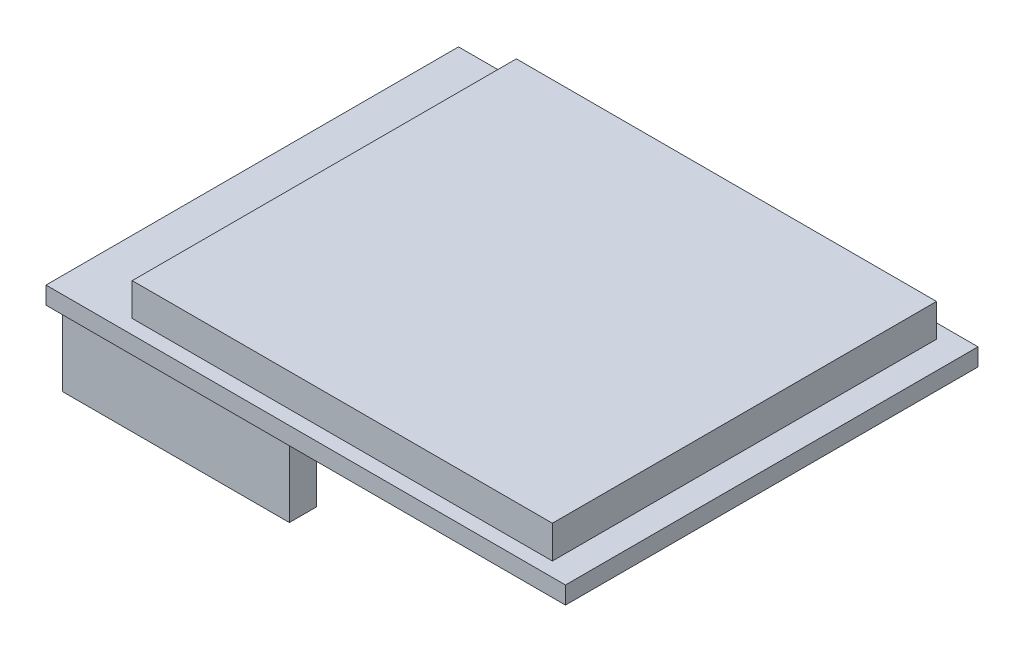
ISO-10303-21;
HEADER;
FILE_DESCRIPTION(('STEP AP214'),'2;1');
FILE_NAME('part.step','',(''),(''),'','','');
FILE_SCHEMA(('AUTOMOTIVE_DESIGN { 1 0 10303 214 1 1 1 1 }'));
ENDSEC;
DATA;
#1=APPLICATION_CONTEXT('core data for automotive mechanical design processes');
#2=APPLICATION_PROTOCOL_DEFINITION('international standard','automotive_design',2000,#1);
#3=PRODUCT_CONTEXT('',#1,'mechanical');
#4=PRODUCT('Part','Part','',(#3));
#5=PRODUCT_RELATED_PRODUCT_CATEGORY('part','',(#4));
#6=PRODUCT_DEFINITION_FORMATION('','',#4);
#7=PRODUCT_DEFINITION_CONTEXT('part definition',#1,'design');
#8=PRODUCT_DEFINITION('design','',#6,#7);
#9=PRODUCT_DEFINITION_SHAPE('','',#8);
#10=(LENGTH_UNIT() NAMED_UNIT(*) SI_UNIT(.MILLI.,.METRE.));
#11=(NAMED_UNIT(*) PLANE_ANGLE_UNIT() SI_UNIT($,.RADIAN.));
#12=(NAMED_UNIT(*) SI_UNIT($,.STERADIAN.) SOLID_ANGLE_UNIT());
#13=UNCERTAINTY_MEASURE_WITH_UNIT(LENGTH_MEASURE(1.E-05),#10,'distance_accuracy_value','');
#14=(GEOMETRIC_REPRESENTATION_CONTEXT(3) GLOBAL_UNCERTAINTY_ASSIGNED_CONTEXT((#13)) GLOBAL_UNIT_ASSIGNED_CONTEXT((#10,
#11,#12)) REPRESENTATION_CONTEXT('',''));
#15=CARTESIAN_POINT('',(0.,0.,0.));
#16=DIRECTION('',(0.,0.,1.));
#17=DIRECTION('',(1.,0.,0.));
#18=AXIS2_PLACEMENT_3D('',#15,#16,#17);
#19=CARTESIAN_POINT('',(-23.8,-7.6,-17.4));
#20=DIRECTION('',(0.,0.,1.));
#21=DIRECTION('',(1.,0.,0.));
#22=AXIS2_PLACEMENT_3D('',#19,#20,#21);
#23=PLANE('',#22);
#24=DIRECTION('',(1.,0.,0.));
#25=VECTOR('',#24,1.);
#26=CARTESIAN_POINT('',(-23.8,0.,-17.4));
#27=LINE('',#26,#25);
#28=CARTESIAN_POINT('',(-23.8,0.,-17.4));
#29=VERTEX_POINT('',#28);
#30=CARTESIAN_POINT('',(-3.,0.,-17.4));
#31=VERTEX_POINT('',#30);
#32=EDGE_CURVE('E113',#29,#31,#27,.T.);
#33=ORIENTED_EDGE('',*,*,#32,.T.);
#34=DIRECTION('',(0.,1.,0.));
#35=VECTOR('',#34,1.);
#36=CARTESIAN_POINT('',(-3.,-7.6,-17.4));
#37=LINE('',#36,#35);
#38=CARTESIAN_POINT('',(-3.,-7.6,-17.4));
#39=VERTEX_POINT('',#38);
#40=EDGE_CURVE('E12',#39,#31,#37,.T.);
#41=ORIENTED_EDGE('',*,*,#40,.F.);
#42=DIRECTION('',(1.,0.,0.));
#43=VECTOR('',#42,1.);
#44=CARTESIAN_POINT('',(-23.8,-7.6,-17.4));
#45=LINE('',#44,#43);
#46=CARTESIAN_POINT('',(-23.8,-7.6,-17.4));
#47=VERTEX_POINT('',#46);
#48=EDGE_CURVE('E101',#47,#39,#45,.T.);
#49=ORIENTED_EDGE('',*,*,#48,.F.);
#50=DIRECTION('',(0.,1.,0.));
#51=VECTOR('',#50,1.);
#52=CARTESIAN_POINT('',(-23.8,-7.6,-17.4));
#53=LINE('',#52,#51);
#54=EDGE_CURVE('E109',#47,#29,#53,.T.);
#55=ORIENTED_EDGE('',*,*,#54,.T.);
#56=EDGE_LOOP('',(#33,#41,#49,#55));
#57=FACE_BOUND('',#56,.T.);
#58=ADVANCED_FACE('F50',(#57),#23,.F.);
#59=CARTESIAN_POINT('',(-3.,-7.6,-17.4));
#60=DIRECTION('',(-1.,0.,0.));
#61=DIRECTION('',(0.,0.,1.));
#62=AXIS2_PLACEMENT_3D('',#59,#60,#61);
#63=PLANE('',#62);
#64=DIRECTION('',(0.,0.,1.));
#65=VECTOR('',#64,1.);
#66=CARTESIAN_POINT('',(-3.,0.,-17.4));
#67=LINE('',#66,#65);
#68=CARTESIAN_POINT('',(-3.,0.,-14.9));
#69=VERTEX_POINT('',#68);
#70=EDGE_CURVE('E105',#31,#69,#67,.T.);
#71=ORIENTED_EDGE('',*,*,#70,.T.);
#72=DIRECTION('',(0.,1.,0.));
#73=VECTOR('',#72,1.);
#74=CARTESIAN_POINT('',(-3.,-7.6,-14.9));
#75=LINE('',#74,#73);
#76=CARTESIAN_POINT('',(-3.,-7.6,-14.9));
#77=VERTEX_POINT('',#76);
#78=EDGE_CURVE('E58',#77,#69,#75,.T.);
#79=ORIENTED_EDGE('',*,*,#78,.F.);
#80=DIRECTION('',(0.,0.,1.));
#81=VECTOR('',#80,1.);
#82=CARTESIAN_POINT('',(-3.,-7.6,-17.4));
#83=LINE('',#82,#81);
#84=EDGE_CURVE('E96',#39,#77,#83,.T.);
#85=ORIENTED_EDGE('',*,*,#84,.F.);
#86=ORIENTED_EDGE('',*,*,#40,.T.);
#87=EDGE_LOOP('',(#71,#79,#85,#86));
#88=FACE_BOUND('',#87,.T.);
#89=ADVANCED_FACE('F104',(#88),#63,.F.);
#90=CARTESIAN_POINT('',(-23.8,-7.6,-14.9));
#91=DIRECTION('',(0.,0.,-1.));
#92=DIRECTION('',(-1.,0.,0.));
#93=AXIS2_PLACEMENT_3D('',#90,#91,#92);
#94=PLANE('',#93);
#95=DIRECTION('',(-1.,0.,0.));
#96=VECTOR('',#95,1.);
#97=CARTESIAN_POINT('',(-23.8,0.,-14.9));
#98=LINE('',#97,#96);
#99=CARTESIAN_POINT('',(-23.8,0.,-14.9));
#100=VERTEX_POINT('',#99);
#101=EDGE_CURVE('E83',#69,#100,#98,.T.);
#102=ORIENTED_EDGE('',*,*,#101,.T.);
#103=DIRECTION('',(0.,1.,0.));
#104=VECTOR('',#103,1.);
#105=CARTESIAN_POINT('',(-23.8,-7.6,-14.9));
#106=LINE('',#105,#104);
#107=CARTESIAN_POINT('',(-23.8,-7.6,-14.9));
#108=VERTEX_POINT('',#107);
#109=EDGE_CURVE('E106',#108,#100,#106,.T.);
#110=ORIENTED_EDGE('',*,*,#109,.F.);
#111=DIRECTION('',(-1.,0.,0.));
#112=VECTOR('',#111,1.);
#113=CARTESIAN_POINT('',(-23.8,-7.6,-14.9));
#114=LINE('',#113,#112);
#115=EDGE_CURVE('E99',#77,#108,#114,.T.);
#116=ORIENTED_EDGE('',*,*,#115,.F.);
#117=ORIENTED_EDGE('',*,*,#78,.T.);
#118=EDGE_LOOP('',(#102,#110,#116,#117));
#119=FACE_BOUND('',#118,.T.);
#120=ADVANCED_FACE('F107',(#119),#94,.F.);
#121=CARTESIAN_POINT('',(-23.8,-7.6,-17.4));
#122=DIRECTION('',(1.,0.,0.));
#123=DIRECTION('',(0.,0.,-1.));
#124=AXIS2_PLACEMENT_3D('',#121,#122,#123);
#125=PLANE('',#124);
#126=DIRECTION('',(0.,0.,-1.));
#127=VECTOR('',#126,1.);
#128=CARTESIAN_POINT('',(-23.8,0.,-17.4));
#129=LINE('',#128,#127);
#130=EDGE_CURVE('E89',#100,#29,#129,.T.);
#131=ORIENTED_EDGE('',*,*,#130,.T.);
#132=ORIENTED_EDGE('',*,*,#54,.F.);
#133=DIRECTION('',(0.,0.,-1.));
#134=VECTOR('',#133,1.);
#135=CARTESIAN_POINT('',(-23.8,-7.6,-17.4));
#136=LINE('',#135,#134);
#137=EDGE_CURVE('E66',#108,#47,#136,.T.);
#138=ORIENTED_EDGE('',*,*,#137,.F.);
#139=ORIENTED_EDGE('',*,*,#109,.T.);
#140=EDGE_LOOP('',(#131,#132,#138,#139));
#141=FACE_BOUND('',#140,.T.);
#142=ADVANCED_FACE('F120',(#141),#125,.F.);
#143=CARTESIAN_POINT('',(0.,-7.6,0.));
#144=DIRECTION('',(0.,-1.,0.));
#145=DIRECTION('',(0.,0.,-1.));
#146=AXIS2_PLACEMENT_3D('',#143,#144,#145);
#147=PLANE('',#146);
#148=ORIENTED_EDGE('',*,*,#48,.T.);
#149=ORIENTED_EDGE('',*,*,#84,.T.);
#150=ORIENTED_EDGE('',*,*,#115,.T.);
#151=ORIENTED_EDGE('',*,*,#137,.T.);
#152=EDGE_LOOP('',(#148,#149,#150,#151));
#153=FACE_BOUND('',#152,.T.);
#154=ADVANCED_FACE('F97',(#153),#147,.T.);
#155=CARTESIAN_POINT('',(0.,0.,0.));
#156=DIRECTION('',(0.,-1.,0.));
#157=DIRECTION('',(0.,0.,-1.));
#158=AXIS2_PLACEMENT_3D('',#155,#156,#157);
#159=PLANE('',#158);
#160=ORIENTED_EDGE('',*,*,#32,.F.);
#161=ORIENTED_EDGE('',*,*,#130,.F.);
#162=ORIENTED_EDGE('',*,*,#101,.F.);
#163=ORIENTED_EDGE('',*,*,#70,.F.);
#164=EDGE_LOOP('',(#160,#161,#162,#163));
#165=FACE_BOUND('',#164,.T.);
#166=ADVANCED_FACE('F123',(#165),#159,.F.);
#167=CLOSED_SHELL('',(#58,#89,#120,#142,#154,#166));
#168=MANIFOLD_SOLID_BREP('B2',#167);
#169=CARTESIAN_POINT('',(-23.8,-7.6,17.4));
#170=DIRECTION('',(1.,0.,0.));
#171=DIRECTION('',(0.,0.,-1.));
#172=AXIS2_PLACEMENT_3D('',#169,#170,#171);
#173=PLANE('',#172);
#174=DIRECTION('',(0.,0.,-1.));
#175=VECTOR('',#174,1.);
#176=CARTESIAN_POINT('',(-23.8,0.,17.4));
#177=LINE('',#176,#175);
#178=CARTESIAN_POINT('',(-23.8,0.,17.4));
#179=VERTEX_POINT('',#178);
#180=CARTESIAN_POINT('',(-23.8,0.,14.9));
#181=VERTEX_POINT('',#180);
#182=EDGE_CURVE('E247',#179,#181,#177,.T.);
#183=ORIENTED_EDGE('',*,*,#182,.T.);
#184=DIRECTION('',(0.,1.,0.));
#185=VECTOR('',#184,1.);
#186=CARTESIAN_POINT('',(-23.8,-7.6,14.9));
#187=LINE('',#186,#185);
#188=CARTESIAN_POINT('',(-23.8,-7.6,14.9));
#189=VERTEX_POINT('',#188);
#190=EDGE_CURVE('E48',#189,#181,#187,.T.);
#191=ORIENTED_EDGE('',*,*,#190,.F.);
#192=DIRECTION('',(0.,0.,-1.));
#193=VECTOR('',#192,1.);
#194=CARTESIAN_POINT('',(-23.8,-7.6,17.4));
#195=LINE('',#194,#193);
#196=CARTESIAN_POINT('',(-23.8,-7.6,17.4));
#197=VERTEX_POINT('',#196);
#198=EDGE_CURVE('E235',#197,#189,#195,.T.);
#199=ORIENTED_EDGE('',*,*,#198,.F.);
#200=DIRECTION('',(0.,1.,0.));
#201=VECTOR('',#200,1.);
#202=CARTESIAN_POINT('',(-23.8,-7.6,17.4));
#203=LINE('',#202,#201);
#204=EDGE_CURVE('E243',#197,#179,#203,.T.);
#205=ORIENTED_EDGE('',*,*,#204,.T.);
#206=EDGE_LOOP('',(#183,#191,#199,#205));
#207=FACE_BOUND('',#206,.T.);
#208=ADVANCED_FACE('F184',(#207),#173,.F.);
#209=CARTESIAN_POINT('',(-23.8,-7.6,14.9));
#210=DIRECTION('',(0.,0.,1.));
#211=DIRECTION('',(1.,0.,0.));
#212=AXIS2_PLACEMENT_3D('',#209,#210,#211);
#213=PLANE('',#212);
#214=DIRECTION('',(1.,0.,0.));
#215=VECTOR('',#214,1.);
#216=CARTESIAN_POINT('',(-23.8,0.,14.9));
#217=LINE('',#216,#215);
#218=CARTESIAN_POINT('',(-3.,0.,14.9));
#219=VERTEX_POINT('',#218);
#220=EDGE_CURVE('E239',#181,#219,#217,.T.);
#221=ORIENTED_EDGE('',*,*,#220,.T.);
#222=DIRECTION('',(0.,1.,0.));
#223=VECTOR('',#222,1.);
#224=CARTESIAN_POINT('',(-3.,-7.6,14.9));
#225=LINE('',#224,#223);
#226=CARTESIAN_POINT('',(-3.,-7.6,14.9));
#227=VERTEX_POINT('',#226);
#228=EDGE_CURVE('E192',#227,#219,#225,.T.);
#229=ORIENTED_EDGE('',*,*,#228,.F.);
#230=DIRECTION('',(1.,0.,0.));
#231=VECTOR('',#230,1.);
#232=CARTESIAN_POINT('',(-23.8,-7.6,14.9));
#233=LINE('',#232,#231);
#234=EDGE_CURVE('E230',#189,#227,#233,.T.);
#235=ORIENTED_EDGE('',*,*,#234,.F.);
#236=ORIENTED_EDGE('',*,*,#190,.T.);
#237=EDGE_LOOP('',(#221,#229,#235,#236));
#238=FACE_BOUND('',#237,.T.);
#239=ADVANCED_FACE('F238',(#238),#213,.F.);
#240=CARTESIAN_POINT('',(-3.,-7.6,17.4));
#241=DIRECTION('',(-1.,0.,0.));
#242=DIRECTION('',(0.,0.,1.));
#243=AXIS2_PLACEMENT_3D('',#240,#241,#242);
#244=PLANE('',#243);
#245=DIRECTION('',(0.,0.,1.));
#246=VECTOR('',#245,1.);
#247=CARTESIAN_POINT('',(-3.,0.,17.4));
#248=LINE('',#247,#246);
#249=CARTESIAN_POINT('',(-3.,0.,17.4));
#250=VERTEX_POINT('',#249);
#251=EDGE_CURVE('E217',#219,#250,#248,.T.);
#252=ORIENTED_EDGE('',*,*,#251,.T.);
#253=DIRECTION('',(0.,1.,0.));
#254=VECTOR('',#253,1.);
#255=CARTESIAN_POINT('',(-3.,-7.6,17.4));
#256=LINE('',#255,#254);
#257=CARTESIAN_POINT('',(-3.,-7.6,17.4));
#258=VERTEX_POINT('',#257);
#259=EDGE_CURVE('E240',#258,#250,#256,.T.);
#260=ORIENTED_EDGE('',*,*,#259,.F.);
#261=DIRECTION('',(0.,0.,1.));
#262=VECTOR('',#261,1.);
#263=CARTESIAN_POINT('',(-3.,-7.6,17.4));
#264=LINE('',#263,#262);
#265=EDGE_CURVE('E233',#227,#258,#264,.T.);
#266=ORIENTED_EDGE('',*,*,#265,.F.);
#267=ORIENTED_EDGE('',*,*,#228,.T.);
#268=EDGE_LOOP('',(#252,#260,#266,#267));
#269=FACE_BOUND('',#268,.T.);
#270=ADVANCED_FACE('F241',(#269),#244,.F.);
#271=CARTESIAN_POINT('',(-23.8,-7.6,17.4));
#272=DIRECTION('',(0.,0.,-1.));
#273=DIRECTION('',(-1.,0.,0.));
#274=AXIS2_PLACEMENT_3D('',#271,#272,#273);
#275=PLANE('',#274);
#276=DIRECTION('',(-1.,0.,0.));
#277=VECTOR('',#276,1.);
#278=CARTESIAN_POINT('',(-23.8,0.,17.4));
#279=LINE('',#278,#277);
#280=EDGE_CURVE('E223',#250,#179,#279,.T.);
#281=ORIENTED_EDGE('',*,*,#280,.T.);
#282=ORIENTED_EDGE('',*,*,#204,.F.);
#283=DIRECTION('',(-1.,0.,0.));
#284=VECTOR('',#283,1.);
#285=CARTESIAN_POINT('',(-23.8,-7.6,17.4));
#286=LINE('',#285,#284);
#287=EDGE_CURVE('E200',#258,#197,#286,.T.);
#288=ORIENTED_EDGE('',*,*,#287,.F.);
#289=ORIENTED_EDGE('',*,*,#259,.T.);
#290=EDGE_LOOP('',(#281,#282,#288,#289));
#291=FACE_BOUND('',#290,.T.);
#292=ADVANCED_FACE('F254',(#291),#275,.F.);
#293=CARTESIAN_POINT('',(0.,-7.6,0.));
#294=DIRECTION('',(0.,-1.,0.));
#295=DIRECTION('',(0.,0.,-1.));
#296=AXIS2_PLACEMENT_3D('',#293,#294,#295);
#297=PLANE('',#296);
#298=ORIENTED_EDGE('',*,*,#198,.T.);
#299=ORIENTED_EDGE('',*,*,#234,.T.);
#300=ORIENTED_EDGE('',*,*,#265,.T.);
#301=ORIENTED_EDGE('',*,*,#287,.T.);
#302=EDGE_LOOP('',(#298,#299,#300,#301));
#303=FACE_BOUND('',#302,.T.);
#304=ADVANCED_FACE('F231',(#303),#297,.T.);
#305=CARTESIAN_POINT('',(0.,0.,0.));
#306=DIRECTION('',(0.,-1.,0.));
#307=DIRECTION('',(0.,0.,-1.));
#308=AXIS2_PLACEMENT_3D('',#305,#306,#307);
#309=PLANE('',#308);
#310=ORIENTED_EDGE('',*,*,#182,.F.);
#311=ORIENTED_EDGE('',*,*,#280,.F.);
#312=ORIENTED_EDGE('',*,*,#251,.F.);
#313=ORIENTED_EDGE('',*,*,#220,.F.);
#314=EDGE_LOOP('',(#310,#311,#312,#313));
#315=FACE_BOUND('',#314,.T.);
#316=ADVANCED_FACE('F257',(#315),#309,.F.);
#317=CLOSED_SHELL('',(#208,#239,#270,#292,#304,#316));
#318=MANIFOLD_SOLID_BREP('B6',#317);
#319=CARTESIAN_POINT('',(-17.2,4.6,-17.6));
#320=DIRECTION('',(1.,0.,0.));
#321=DIRECTION('',(0.,0.,-1.));
#322=AXIS2_PLACEMENT_3D('',#319,#320,#321);
#323=PLANE('',#322);
#324=DIRECTION('',(0.,0.,1.));
#325=VECTOR('',#324,1.);
#326=CARTESIAN_POINT('',(-17.2,1.6,-17.6));
#327=LINE('',#326,#325);
#328=CARTESIAN_POINT('',(-17.2,1.6,-17.6));
#329=VERTEX_POINT('',#328);
#330=CARTESIAN_POINT('',(-17.2,1.6,17.6));
#331=VERTEX_POINT('',#330);
#332=EDGE_CURVE('E380',#329,#331,#327,.T.);
#333=ORIENTED_EDGE('',*,*,#332,.T.);
#334=DIRECTION('',(0.,-1.,0.));
#335=VECTOR('',#334,1.);
#336=CARTESIAN_POINT('',(-17.2,4.6,17.6));
#337=LINE('',#336,#335);
#338=CARTESIAN_POINT('',(-17.2,4.6,17.6));
#339=VERTEX_POINT('',#338);
#340=EDGE_CURVE('E182',#339,#331,#337,.T.);
#341=ORIENTED_EDGE('',*,*,#340,.F.);
#342=DIRECTION('',(0.,0.,1.));
#343=VECTOR('',#342,1.);
#344=CARTESIAN_POINT('',(-17.2,4.6,-17.6));
#345=LINE('',#344,#343);
#346=CARTESIAN_POINT('',(-17.2,4.6,-17.6));
#347=VERTEX_POINT('',#346);
#348=EDGE_CURVE('E368',#347,#339,#345,.T.);
#349=ORIENTED_EDGE('',*,*,#348,.F.);
#350=DIRECTION('',(0.,-1.,0.));
#351=VECTOR('',#350,1.);
#352=CARTESIAN_POINT('',(-17.2,4.6,-17.6));
#353=LINE('',#352,#351);
#354=EDGE_CURVE('E376',#347,#329,#353,.T.);
#355=ORIENTED_EDGE('',*,*,#354,.T.);
#356=EDGE_LOOP('',(#333,#341,#349,#355));
#357=FACE_BOUND('',#356,.T.);
#358=ADVANCED_FACE('F317',(#357),#323,.F.);
#359=CARTESIAN_POINT('',(-17.2,4.6,17.6));
#360=DIRECTION('',(0.,0.,-1.));
#361=DIRECTION('',(-1.,0.,0.));
#362=AXIS2_PLACEMENT_3D('',#359,#360,#361);
#363=PLANE('',#362);
#364=DIRECTION('',(1.,0.,0.));
#365=VECTOR('',#364,1.);
#366=CARTESIAN_POINT('',(-17.2,1.6,17.6));
#367=LINE('',#366,#365);
#368=CARTESIAN_POINT('',(21.3,1.6,17.6));
#369=VERTEX_POINT('',#368);
#370=EDGE_CURVE('E372',#331,#369,#367,.T.);
#371=ORIENTED_EDGE('',*,*,#370,.T.);
#372=DIRECTION('',(0.,-1.,0.));
#373=VECTOR('',#372,1.);
#374=CARTESIAN_POINT('',(21.3,4.6,17.6));
#375=LINE('',#374,#373);
#376=CARTESIAN_POINT('',(21.3,4.6,17.6));
#377=VERTEX_POINT('',#376);
#378=EDGE_CURVE('E325',#377,#369,#375,.T.);
#379=ORIENTED_EDGE('',*,*,#378,.F.);
#380=DIRECTION('',(1.,0.,0.));
#381=VECTOR('',#380,1.);
#382=CARTESIAN_POINT('',(-17.2,4.6,17.6));
#383=LINE('',#382,#381);
#384=EDGE_CURVE('E363',#339,#377,#383,.T.);
#385=ORIENTED_EDGE('',*,*,#384,.F.);
#386=ORIENTED_EDGE('',*,*,#340,.T.);
#387=EDGE_LOOP('',(#371,#379,#385,#386));
#388=FACE_BOUND('',#387,.T.);
#389=ADVANCED_FACE('F371',(#388),#363,.F.);
#390=CARTESIAN_POINT('',(21.3,4.6,-17.6));
#391=DIRECTION('',(-1.,0.,0.));
#392=DIRECTION('',(0.,0.,1.));
#393=AXIS2_PLACEMENT_3D('',#390,#391,#392);
#394=PLANE('',#393);
#395=DIRECTION('',(0.,0.,-1.));
#396=VECTOR('',#395,1.);
#397=CARTESIAN_POINT('',(21.3,1.6,-17.6));
#398=LINE('',#397,#396);
#399=CARTESIAN_POINT('',(21.3,1.6,-17.6));
#400=VERTEX_POINT('',#399);
#401=EDGE_CURVE('E350',#369,#400,#398,.T.);
#402=ORIENTED_EDGE('',*,*,#401,.T.);
#403=DIRECTION('',(0.,-1.,0.));
#404=VECTOR('',#403,1.);
#405=CARTESIAN_POINT('',(21.3,4.6,-17.6));
#406=LINE('',#405,#404);
#407=CARTESIAN_POINT('',(21.3,4.6,-17.6));
#408=VERTEX_POINT('',#407);
#409=EDGE_CURVE('E373',#408,#400,#406,.T.);
#410=ORIENTED_EDGE('',*,*,#409,.F.);
#411=DIRECTION('',(0.,0.,-1.));
#412=VECTOR('',#411,1.);
#413=CARTESIAN_POINT('',(21.3,4.6,-17.6));
#414=LINE('',#413,#412);
#415=EDGE_CURVE('E366',#377,#408,#414,.T.);
#416=ORIENTED_EDGE('',*,*,#415,.F.);
#417=ORIENTED_EDGE('',*,*,#378,.T.);
#418=EDGE_LOOP('',(#402,#410,#416,#417));
#419=FACE_BOUND('',#418,.T.);
#420=ADVANCED_FACE('F374',(#419),#394,.F.);
#421=CARTESIAN_POINT('',(-17.2,4.6,-17.6));
#422=DIRECTION('',(0.,0.,1.));
#423=DIRECTION('',(1.,0.,0.));
#424=AXIS2_PLACEMENT_3D('',#421,#422,#423);
#425=PLANE('',#424);
#426=DIRECTION('',(-1.,0.,0.));
#427=VECTOR('',#426,1.);
#428=CARTESIAN_POINT('',(-17.2,1.6,-17.6));
#429=LINE('',#428,#427);
#430=EDGE_CURVE('E356',#400,#329,#429,.T.);
#431=ORIENTED_EDGE('',*,*,#430,.T.);
#432=ORIENTED_EDGE('',*,*,#354,.F.);
#433=DIRECTION('',(-1.,0.,0.));
#434=VECTOR('',#433,1.);
#435=CARTESIAN_POINT('',(-17.2,4.6,-17.6));
#436=LINE('',#435,#434);
#437=EDGE_CURVE('E333',#408,#347,#436,.T.);
#438=ORIENTED_EDGE('',*,*,#437,.F.);
#439=ORIENTED_EDGE('',*,*,#409,.T.);
#440=EDGE_LOOP('',(#431,#432,#438,#439));
#441=FACE_BOUND('',#440,.T.);
#442=ADVANCED_FACE('F387',(#441),#425,.F.);
#443=CARTESIAN_POINT('',(0.,4.6,0.));
#444=DIRECTION('',(0.,1.,0.));
#445=DIRECTION('',(0.,0.,1.));
#446=AXIS2_PLACEMENT_3D('',#443,#444,#445);
#447=PLANE('',#446);
#448=ORIENTED_EDGE('',*,*,#348,.T.);
#449=ORIENTED_EDGE('',*,*,#384,.T.);
#450=ORIENTED_EDGE('',*,*,#415,.T.);
#451=ORIENTED_EDGE('',*,*,#437,.T.);
#452=EDGE_LOOP('',(#448,#449,#450,#451));
#453=FACE_BOUND('',#452,.T.);
#454=ADVANCED_FACE('F364',(#453),#447,.T.);
#455=CARTESIAN_POINT('',(0.,1.6,0.));
#456=DIRECTION('',(0.,1.,0.));
#457=DIRECTION('',(0.,0.,1.));
#458=AXIS2_PLACEMENT_3D('',#455,#456,#457);
#459=PLANE('',#458);
#460=ORIENTED_EDGE('',*,*,#332,.F.);
#461=ORIENTED_EDGE('',*,*,#430,.F.);
#462=ORIENTED_EDGE('',*,*,#401,.F.);
#463=ORIENTED_EDGE('',*,*,#370,.F.);
#464=EDGE_LOOP('',(#460,#461,#462,#463));
#465=FACE_BOUND('',#464,.T.);
#466=ADVANCED_FACE('F390',(#465),#459,.F.);
#467=CLOSED_SHELL('',(#358,#389,#420,#442,#454,#466));
#468=MANIFOLD_SOLID_BREP('B42',#467);
#469=CARTESIAN_POINT('',(23.8,1.6,18.9));
#470=DIRECTION('',(-1.,0.,0.));
#471=DIRECTION('',(0.,0.,1.));
#472=AXIS2_PLACEMENT_3D('',#469,#470,#471);
#473=PLANE('',#472);
#474=DIRECTION('',(0.,0.,-1.));
#475=VECTOR('',#474,1.);
#476=CARTESIAN_POINT('',(23.8,0.,18.9));
#477=LINE('',#476,#475);
#478=CARTESIAN_POINT('',(23.8,0.,18.9));
#479=VERTEX_POINT('',#478);
#480=CARTESIAN_POINT('',(23.8,0.,-18.9));
#481=VERTEX_POINT('',#480);
#482=EDGE_CURVE('E516',#479,#481,#477,.T.);
#483=ORIENTED_EDGE('',*,*,#482,.T.);
#484=DIRECTION('',(0.,-1.,0.));
#485=VECTOR('',#484,1.);
#486=CARTESIAN_POINT('',(23.8,1.6,-18.9));
#487=LINE('',#486,#485);
#488=CARTESIAN_POINT('',(23.8,1.6,-18.9));
#489=VERTEX_POINT('',#488);
#490=EDGE_CURVE('E315',#489,#481,#487,.T.);
#491=ORIENTED_EDGE('',*,*,#490,.F.);
#492=DIRECTION('',(0.,0.,-1.));
#493=VECTOR('',#492,1.);
#494=CARTESIAN_POINT('',(23.8,1.6,18.9));
#495=LINE('',#494,#493);
#496=CARTESIAN_POINT('',(23.8,1.6,18.9));
#497=VERTEX_POINT('',#496);
#498=EDGE_CURVE('E504',#497,#489,#495,.T.);
#499=ORIENTED_EDGE('',*,*,#498,.F.);
#500=DIRECTION('',(0.,-1.,0.));
#501=VECTOR('',#500,1.);
#502=CARTESIAN_POINT('',(23.8,1.6,18.9));
#503=LINE('',#502,#501);
#504=EDGE_CURVE('E512',#497,#479,#503,.T.);
#505=ORIENTED_EDGE('',*,*,#504,.T.);
#506=EDGE_LOOP('',(#483,#491,#499,#505));
#507=FACE_BOUND('',#506,.T.);
#508=ADVANCED_FACE('F453',(#507),#473,.F.);
#509=CARTESIAN_POINT('',(-23.8,1.6,-18.9));
#510=DIRECTION('',(0.,0.,1.));
#511=DIRECTION('',(1.,0.,0.));
#512=AXIS2_PLACEMENT_3D('',#509,#510,#511);
#513=PLANE('',#512);
#514=DIRECTION('',(-1.,0.,0.));
#515=VECTOR('',#514,1.);
#516=CARTESIAN_POINT('',(-23.8,0.,-18.9));
#517=LINE('',#516,#515);
#518=CARTESIAN_POINT('',(-23.8,0.,-18.9));
#519=VERTEX_POINT('',#518);
#520=EDGE_CURVE('E508',#481,#519,#517,.T.);
#521=ORIENTED_EDGE('',*,*,#520,.T.);
#522=DIRECTION('',(0.,-1.,0.));
#523=VECTOR('',#522,1.);
#524=CARTESIAN_POINT('',(-23.8,1.6,-18.9));
#525=LINE('',#524,#523);
#526=CARTESIAN_POINT('',(-23.8,1.6,-18.9));
#527=VERTEX_POINT('',#526);
#528=EDGE_CURVE('E461',#527,#519,#525,.T.);
#529=ORIENTED_EDGE('',*,*,#528,.F.);
#530=DIRECTION('',(-1.,0.,0.));
#531=VECTOR('',#530,1.);
#532=CARTESIAN_POINT('',(-23.8,1.6,-18.9));
#533=LINE('',#532,#531);
#534=EDGE_CURVE('E499',#489,#527,#533,.T.);
#535=ORIENTED_EDGE('',*,*,#534,.F.);
#536=ORIENTED_EDGE('',*,*,#490,.T.);
#537=EDGE_LOOP('',(#521,#529,#535,#536));
#538=FACE_BOUND('',#537,.T.);
#539=ADVANCED_FACE('F507',(#538),#513,.F.);
#540=CARTESIAN_POINT('',(-23.8,1.6,18.9));
#541=DIRECTION('',(1.,0.,0.));
#542=DIRECTION('',(0.,0.,-1.));
#543=AXIS2_PLACEMENT_3D('',#540,#541,#542);
#544=PLANE('',#543);
#545=DIRECTION('',(0.,0.,1.));
#546=VECTOR('',#545,1.);
#547=CARTESIAN_POINT('',(-23.8,0.,18.9));
#548=LINE('',#547,#546);
#549=CARTESIAN_POINT('',(-23.8,0.,18.9));
#550=VERTEX_POINT('',#549);
#551=EDGE_CURVE('E486',#519,#550,#548,.T.);
#552=ORIENTED_EDGE('',*,*,#551,.T.);
#553=DIRECTION('',(0.,-1.,0.));
#554=VECTOR('',#553,1.);
#555=CARTESIAN_POINT('',(-23.8,1.6,18.9));
#556=LINE('',#555,#554);
#557=CARTESIAN_POINT('',(-23.8,1.6,18.9));
#558=VERTEX_POINT('',#557);
#559=EDGE_CURVE('E509',#558,#550,#556,.T.);
#560=ORIENTED_EDGE('',*,*,#559,.F.);
#561=DIRECTION('',(0.,0.,1.));
#562=VECTOR('',#561,1.);
#563=CARTESIAN_POINT('',(-23.8,1.6,18.9));
#564=LINE('',#563,#562);
#565=EDGE_CURVE('E502',#527,#558,#564,.T.);
#566=ORIENTED_EDGE('',*,*,#565,.F.);
#567=ORIENTED_EDGE('',*,*,#528,.T.);
#568=EDGE_LOOP('',(#552,#560,#566,#567));
#569=FACE_BOUND('',#568,.T.);
#570=ADVANCED_FACE('F510',(#569),#544,.F.);
#571=CARTESIAN_POINT('',(-23.8,1.6,18.9));
#572=DIRECTION('',(0.,0.,-1.));
#573=DIRECTION('',(-1.,0.,0.));
#574=AXIS2_PLACEMENT_3D('',#571,#572,#573);
#575=PLANE('',#574);
#576=DIRECTION('',(1.,0.,0.));
#577=VECTOR('',#576,1.);
#578=CARTESIAN_POINT('',(-23.8,0.,18.9));
#579=LINE('',#578,#577);
#580=EDGE_CURVE('E492',#550,#479,#579,.T.);
#581=ORIENTED_EDGE('',*,*,#580,.T.);
#582=ORIENTED_EDGE('',*,*,#504,.F.);
#583=DIRECTION('',(1.,0.,0.));
#584=VECTOR('',#583,1.);
#585=CARTESIAN_POINT('',(-23.8,1.6,18.9));
#586=LINE('',#585,#584);
#587=EDGE_CURVE('E469',#558,#497,#586,.T.);
#588=ORIENTED_EDGE('',*,*,#587,.F.);
#589=ORIENTED_EDGE('',*,*,#559,.T.);
#590=EDGE_LOOP('',(#581,#582,#588,#589));
#591=FACE_BOUND('',#590,.T.);
#592=ADVANCED_FACE('F523',(#591),#575,.F.);
#593=CARTESIAN_POINT('',(0.,1.6,0.));
#594=DIRECTION('',(0.,-1.,0.));
#595=DIRECTION('',(0.,0.,-1.));
#596=AXIS2_PLACEMENT_3D('',#593,#594,#595);
#597=PLANE('',#596);
#598=ORIENTED_EDGE('',*,*,#498,.T.);
#599=ORIENTED_EDGE('',*,*,#534,.T.);
#600=ORIENTED_EDGE('',*,*,#565,.T.);
#601=ORIENTED_EDGE('',*,*,#587,.T.);
#602=EDGE_LOOP('',(#598,#599,#600,#601));
#603=FACE_BOUND('',#602,.T.);
#604=ADVANCED_FACE('F500',(#603),#597,.F.);
#605=CARTESIAN_POINT('',(0.,0.,0.));
#606=DIRECTION('',(0.,-1.,0.));
#607=DIRECTION('',(0.,0.,-1.));
#608=AXIS2_PLACEMENT_3D('',#605,#606,#607);
#609=PLANE('',#608);
#610=ORIENTED_EDGE('',*,*,#482,.F.);
#611=ORIENTED_EDGE('',*,*,#580,.F.);
#612=ORIENTED_EDGE('',*,*,#551,.F.);
#613=ORIENTED_EDGE('',*,*,#520,.F.);
#614=EDGE_LOOP('',(#610,#611,#612,#613));
#615=FACE_BOUND('',#614,.T.);
#616=ADVANCED_FACE('F526',(#615),#609,.T.);
#617=CLOSED_SHELL('',(#508,#539,#570,#592,#604,#616));
#618=MANIFOLD_SOLID_BREP('B176',#617);
#619=ADVANCED_BREP_SHAPE_REPRESENTATION('',(#18,#168,#318,#468,#618),#14);
#620=SHAPE_DEFINITION_REPRESENTATION(#9,#619);
ENDSEC;
END-ISO-10303-21;
